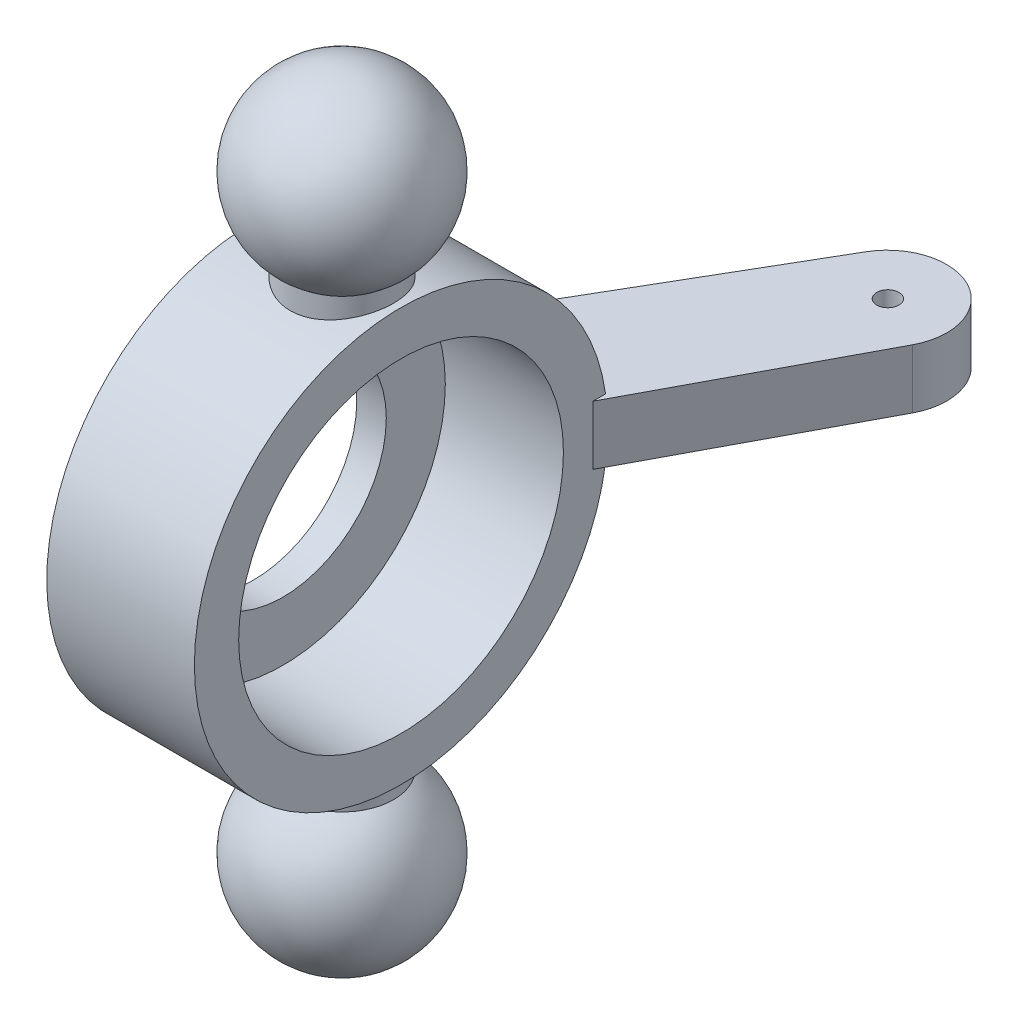
ISO-10303-21;
HEADER;
FILE_DESCRIPTION(('STEP AP214'),'2;1');
FILE_NAME('part.step','',(''),(''),'','','');
FILE_SCHEMA(('AUTOMOTIVE_DESIGN { 1 0 10303 214 1 1 1 1 }'));
ENDSEC;
DATA;
#1=APPLICATION_CONTEXT('core data for automotive mechanical design processes');
#2=APPLICATION_PROTOCOL_DEFINITION('international standard','automotive_design',2000,#1);
#3=PRODUCT_CONTEXT('',#1,'mechanical');
#4=PRODUCT('Part','Part','',(#3));
#5=PRODUCT_RELATED_PRODUCT_CATEGORY('part','',(#4));
#6=PRODUCT_DEFINITION_FORMATION('','',#4);
#7=PRODUCT_DEFINITION_CONTEXT('part definition',#1,'design');
#8=PRODUCT_DEFINITION('design','',#6,#7);
#9=PRODUCT_DEFINITION_SHAPE('','',#8);
#10=(LENGTH_UNIT() NAMED_UNIT(*) SI_UNIT(.MILLI.,.METRE.));
#11=(NAMED_UNIT(*) PLANE_ANGLE_UNIT() SI_UNIT($,.RADIAN.));
#12=(NAMED_UNIT(*) SI_UNIT($,.STERADIAN.) SOLID_ANGLE_UNIT());
#13=UNCERTAINTY_MEASURE_WITH_UNIT(LENGTH_MEASURE(1.E-05),#10,'distance_accuracy_value','');
#14=(GEOMETRIC_REPRESENTATION_CONTEXT(3) GLOBAL_UNCERTAINTY_ASSIGNED_CONTEXT((#13)) GLOBAL_UNIT_ASSIGNED_CONTEXT((#10,
#11,#12)) REPRESENTATION_CONTEXT('',''));
#15=CARTESIAN_POINT('',(0.,0.,0.));
#16=DIRECTION('',(0.,0.,1.));
#17=DIRECTION('',(1.,0.,0.));
#18=AXIS2_PLACEMENT_3D('',#15,#16,#17);
#19=CARTESIAN_POINT('',(20.,0.,0.));
#20=DIRECTION('',(-1.,0.,0.));
#21=DIRECTION('',(0.,0.,-1.));
#22=AXIS2_PLACEMENT_3D('',#19,#20,#21);
#23=PLANE('',#22);
#24=CARTESIAN_POINT('',(20.,0.,0.));
#25=DIRECTION('',(1.,0.,0.));
#26=DIRECTION('',(0.,0.,-1.));
#27=AXIS2_PLACEMENT_3D('',#24,#25,#26);
#28=CIRCLE('',#27,11.);
#29=CARTESIAN_POINT('',(20.,0.,-11.));
#30=VERTEX_POINT('',#29);
#31=EDGE_CURVE('E176',#30,#30,#28,.T.);
#32=ORIENTED_EDGE('',*,*,#31,.F.);
#33=EDGE_LOOP('',(#32));
#34=FACE_BOUND('',#33,.T.);
#35=DIRECTION('',(0.,0.,1.));
#36=VECTOR('',#35,1.);
#37=CARTESIAN_POINT('',(20.,-2.,0.));
#38=LINE('',#37,#36);
#39=CARTESIAN_POINT('',(20.,-2.,-13.856406460551));
#40=VERTEX_POINT('',#39);
#41=CARTESIAN_POINT('',(20.,-2.,-13.));
#42=VERTEX_POINT('',#41);
#43=EDGE_CURVE('E159',#40,#42,#38,.T.);
#44=ORIENTED_EDGE('',*,*,#43,.T.);
#45=DIRECTION('',(0.,1.,0.));
#46=VECTOR('',#45,1.);
#47=CARTESIAN_POINT('',(20.,-2.,-13.));
#48=LINE('',#47,#46);
#49=CARTESIAN_POINT('',(20.,2.,-13.));
#50=VERTEX_POINT('',#49);
#51=EDGE_CURVE('E147',#42,#50,#48,.T.);
#52=ORIENTED_EDGE('',*,*,#51,.T.);
#53=DIRECTION('',(0.,0.,1.));
#54=VECTOR('',#53,1.);
#55=CARTESIAN_POINT('',(20.,2.,0.));
#56=LINE('',#55,#54);
#57=CARTESIAN_POINT('',(20.,2.,-13.856406460551));
#58=VERTEX_POINT('',#57);
#59=EDGE_CURVE('E156',#58,#50,#56,.T.);
#60=ORIENTED_EDGE('',*,*,#59,.F.);
#61=CARTESIAN_POINT('',(20.,0.,0.));
#62=DIRECTION('',(1.,0.,0.));
#63=DIRECTION('',(0.,0.,-1.));
#64=AXIS2_PLACEMENT_3D('',#61,#62,#63);
#65=CIRCLE('',#64,14.);
#66=EDGE_CURVE('E179',#58,#40,#65,.T.);
#67=ORIENTED_EDGE('',*,*,#66,.T.);
#68=EDGE_LOOP('',(#44,#52,#60,#67));
#69=FACE_BOUND('',#68,.T.);
#70=ADVANCED_FACE('F39',(#34,#69),#23,.F.);
#71=CARTESIAN_POINT('',(12.,0.,0.));
#72=DIRECTION('',(1.,0.,0.));
#73=DIRECTION('',(0.,0.,1.));
#74=AXIS2_PLACEMENT_3D('',#71,#72,#73);
#75=CYLINDRICAL_SURFACE('',#74,14.);
#76=CARTESIAN_POINT('',(10.,0.,0.));
#77=DIRECTION('',(1.,0.,0.));
#78=DIRECTION('',(0.,0.,-1.));
#79=AXIS2_PLACEMENT_3D('',#76,#77,#78);
#80=CIRCLE('',#79,14.);
#81=CARTESIAN_POINT('',(10.,0.,-14.));
#82=VERTEX_POINT('',#81);
#83=EDGE_CURVE('E167',#82,#82,#80,.T.);
#84=ORIENTED_EDGE('',*,*,#83,.T.);
#85=EDGE_LOOP('',(#84));
#86=FACE_BOUND('',#85,.T.);
#87=CARTESIAN_POINT('',(16.,13.555441711726,-3.5));
#88=CARTESIAN_POINT('',(15.8067289487028,13.55544540123,-3.4999945100303));
#89=CARTESIAN_POINT('',(15.6133971418501,13.5596202842044,-3.48393674369671));
#90=CARTESIAN_POINT('',(15.2322853905571,13.5758260678959,-3.42023237564931));
#91=CARTESIAN_POINT('',(15.0445087437445,13.5878615407028,-3.37256738943895));
#92=CARTESIAN_POINT('',(14.6800750465379,13.6183421443461,-3.24728767948486));
#93=CARTESIAN_POINT('',(14.50340398246,13.6367789976664,-3.16971161899629));
#94=CARTESIAN_POINT('',(14.1655648064442,13.6779746884026,-2.98692959776594));
#95=CARTESIAN_POINT('',(14.0043973530877,13.7007337092988,-2.88172246398496));
#96=CARTESIAN_POINT('',(13.6985936966329,13.7485700289787,-2.64419179823663));
#97=CARTESIAN_POINT('',(13.5543489595099,13.7736843667225,-2.51137164278567));
#98=CARTESIAN_POINT('',(13.2899340478955,13.8230802572141,-2.22345488974093));
#99=CARTESIAN_POINT('',(13.1697661241296,13.8473617319294,-2.06835621185243));
#100=CARTESIAN_POINT('',(12.9553143453162,13.8927658172882,-1.73760328151054));
#101=CARTESIAN_POINT('',(12.861415056574,13.9138396236083,-1.56169240667317));
#102=CARTESIAN_POINT('',(12.7046664981857,13.9500313669638,-1.19596845800987));
#103=CARTESIAN_POINT('',(12.6418126473183,13.9651501826808,-1.00615744010872));
#104=CARTESIAN_POINT('',(12.55019303159,13.9874666238745,-0.622102262255826));
#105=CARTESIAN_POINT('',(12.5207624979428,13.9948185138204,-0.428025807368566));
#106=CARTESIAN_POINT('',(12.4947382690142,14.0013103175022,-0.0375603469678755));
#107=CARTESIAN_POINT('',(12.4981397189066,14.000451445354,0.1588283123533));
#108=CARTESIAN_POINT('',(12.5372047903502,13.9907333293494,0.543732865103353));
#109=CARTESIAN_POINT('',(12.5721508550754,13.9820520327718,0.732326754603722));
#110=CARTESIAN_POINT('',(12.6721597780679,13.9578717113484,1.10088386594792));
#111=CARTESIAN_POINT('',(12.7372242395285,13.9423723235797,1.28084662779658));
#112=CARTESIAN_POINT('',(12.8962035989618,13.906025135811,1.62892346225627));
#113=CARTESIAN_POINT('',(12.9903738625261,13.8851302757249,1.79691578418258));
#114=CARTESIAN_POINT('',(13.2046979507632,13.8402586533409,2.1149646781919));
#115=CARTESIAN_POINT('',(13.3248562959863,13.8162813551566,2.26501812279998));
#116=CARTESIAN_POINT('',(13.5915922387738,13.767091992751,2.54720912279662));
#117=CARTESIAN_POINT('',(13.7387968492812,13.7418640732785,2.67875187676046));
#118=CARTESIAN_POINT('',(14.0534399629621,13.6936106093183,2.91541731587331));
#119=CARTESIAN_POINT('',(14.2208794113088,13.6705851677987,3.0205387661713));
#120=CARTESIAN_POINT('',(14.572406047792,13.6292869553258,3.20175845157131));
#121=CARTESIAN_POINT('',(14.7565700223683,13.6110377709745,3.27771348436242));
#122=CARTESIAN_POINT('',(15.1356196552351,13.5816609610198,3.39739967219245));
#123=CARTESIAN_POINT('',(15.3305030095563,13.5705318115174,3.44113772292637));
#124=CARTESIAN_POINT('',(15.7199433021574,13.5569749843781,3.49416149414056));
#125=CARTESIAN_POINT('',(15.9143729106816,13.5543252457504,3.50432666348898));
#126=CARTESIAN_POINT('',(16.3021507112152,13.5574228070324,3.49232378671901));
#127=CARTESIAN_POINT('',(16.4954990011281,13.5631693339647,3.47015871698913));
#128=CARTESIAN_POINT('',(16.8723599709291,13.5821991478089,3.39489564951413));
#129=CARTESIAN_POINT('',(17.0559818171972,13.5953575834006,3.34230969559482));
#130=CARTESIAN_POINT('',(17.4118040409944,13.6276100556741,3.20826531433849));
#131=CARTESIAN_POINT('',(17.584003062678,13.6467047954483,3.12680346679746));
#132=CARTESIAN_POINT('',(17.9158177890137,13.6891459193386,2.93547893511129));
#133=CARTESIAN_POINT('',(18.0751203760602,13.7125683605018,2.82509045536991));
#134=CARTESIAN_POINT('',(18.373263707922,13.7608391629952,2.57971102527057));
#135=CARTESIAN_POINT('',(18.5121010833101,13.7856877581962,2.44471603181903));
#136=CARTESIAN_POINT('',(18.7689354595993,13.8347636424449,2.14991952344655));
#137=CARTESIAN_POINT('',(18.8863240875683,13.8589598288664,1.98958183386057));
#138=CARTESIAN_POINT('',(19.0925102137317,13.9033610325916,1.65095938943136));
#139=CARTESIAN_POINT('',(19.1813092032515,13.9235662580553,1.47267557135157));
#140=CARTESIAN_POINT('',(19.3270244483391,13.9575816203366,1.10445370605882));
#141=CARTESIAN_POINT('',(19.3841699981307,13.9714376203137,0.914610833597587));
#142=CARTESIAN_POINT('',(19.4656444684518,13.991394107541,0.527624161115824));
#143=CARTESIAN_POINT('',(19.4899797222347,13.9974960915079,0.330481777644342));
#144=CARTESIAN_POINT('',(19.5047865635144,14.0011959293082,-0.0597923425516314));
#145=CARTESIAN_POINT('',(19.4961559818339,13.9990192607996,-0.252888394381077));
#146=CARTESIAN_POINT('',(19.4473326044698,13.9869063760105,-0.634786237451629));
#147=CARTESIAN_POINT('',(19.4071407474539,13.9769703905009,-0.823588156233251));
#148=CARTESIAN_POINT('',(19.296817230802,13.9504901498861,-1.19059862475671));
#149=CARTESIAN_POINT('',(19.2268479133997,13.9339817575837,-1.36885873103302));
#150=CARTESIAN_POINT('',(19.0591029734315,13.896095111978,-1.71120968564569));
#151=CARTESIAN_POINT('',(18.9613238456533,13.8747162448565,-1.87529874442972));
#152=CARTESIAN_POINT('',(18.7379966810135,13.82875373881,-2.18890674948156));
#153=CARTESIAN_POINT('',(18.6118394998366,13.8041055929583,-2.33798245904418));
#154=CARTESIAN_POINT('',(18.3365200180793,13.7546727170016,-2.61315257095726));
#155=CARTESIAN_POINT('',(18.1873518936109,13.7298879538556,-2.73924113776807));
#156=CARTESIAN_POINT('',(17.8668950503369,13.6824616545926,-2.96716709265141));
#157=CARTESIAN_POINT('',(17.6952455682216,13.6598687285651,-3.06850816795732));
#158=CARTESIAN_POINT('',(17.3368057854381,13.620038442319,-3.24074413804914));
#159=CARTESIAN_POINT('',(17.1500266186715,13.6027971881625,-3.31166118413253));
#160=CARTESIAN_POINT('',(16.8029804585769,13.5783168062758,-3.41047884999851));
#161=CARTESIAN_POINT('',(16.6443739246485,13.5698032051225,-3.44397609708907));
#162=CARTESIAN_POINT('',(16.3238589585081,13.5583643503917,-3.48873802400119));
#163=CARTESIAN_POINT('',(16.1619508091446,13.5554386201188,-3.50000460030113));
#164=CARTESIAN_POINT('',(16.,13.555441711726,-3.5));
#165=B_SPLINE_CURVE_WITH_KNOTS('',3,(#87,#88,#89,#90,#91,#92,#93,#94,#95,#96,#97,#98,#99,#100,
#101,#102,#103,#104,#105,#106,#107,#108,#109,#110,#111,#112,#113,#114,#115,#116,#117,#118,#119,
#120,#121,#122,#123,#124,#125,#126,#127,#128,#129,#130,#131,#132,#133,#134,#135,#136,#137,#138,
#139,#140,#141,#142,#143,#144,#145,#146,#147,#148,#149,#150,#151,#152,#153,#154,#155,#156,#157,
#158,#159,#160,#161,#162,#163,#164),.UNSPECIFIED.,.T.,.F.,(4,2,2,2,2,2,2,2,2,2,2,2,2,2,2,2,2,2,
2,2,2,2,2,2,2,2,2,2,2,2,2,2,2,2,2,2,2,2,4),(0.,0.57921841843059,1.15877403800013,
1.73758301803243,2.3164165745767,2.90673535870167,3.49710930071813,4.09572094957088,
4.69424423785929,5.28064251393485,5.86695408132429,6.44025567764526,7.01358779414701,
7.59210023956223,8.17071339656479,8.76498653200676,9.35928743679723,9.95647004813416,
10.5535248018492,11.1348100467344,11.716041780678,12.2877636702336,12.8595533000046,
13.4425598421329,14.0256622644954,14.6233546336192,15.2210158201785,15.8142890194017,
16.4074476848313,16.9845682458891,17.5616716433825,18.1356682719407,18.7097372804377,
19.2975593522537,19.8855304420219,20.4844706821114,21.0829740992857,21.5683695806357,
22.0537236515463),.UNSPECIFIED.);
#166=CARTESIAN_POINT('',(16.,13.555441711726,-3.5));
#167=VERTEX_POINT('',#166);
#168=EDGE_CURVE('E180',#167,#167,#165,.T.);
#169=ORIENTED_EDGE('',*,*,#168,.F.);
#170=EDGE_LOOP('',(#169));
#171=FACE_BOUND('',#170,.T.);
#172=CARTESIAN_POINT('',(16.,-13.555441711726,-3.5));
#173=CARTESIAN_POINT('',(16.1932710512972,-13.55544540123,-3.4999945100303));
#174=CARTESIAN_POINT('',(16.3866028581499,-13.5596202842044,-3.48393674369671));
#175=CARTESIAN_POINT('',(16.7677146094429,-13.5758260678959,-3.42023237564931));
#176=CARTESIAN_POINT('',(16.9554912562555,-13.5878615407028,-3.37256738943895));
#177=CARTESIAN_POINT('',(17.3199249534621,-13.6183421443461,-3.24728767948486));
#178=CARTESIAN_POINT('',(17.49659601754,-13.6367789976664,-3.16971161899629));
#179=CARTESIAN_POINT('',(17.8344351935558,-13.6779746884026,-2.98692959776594));
#180=CARTESIAN_POINT('',(17.9956026469123,-13.7007337092988,-2.88172246398496));
#181=CARTESIAN_POINT('',(18.3014063033671,-13.7485700289787,-2.64419179823663));
#182=CARTESIAN_POINT('',(18.4456510404901,-13.7736843667225,-2.51137164278567));
#183=CARTESIAN_POINT('',(18.7100659521045,-13.8230802572141,-2.22345488974093));
#184=CARTESIAN_POINT('',(18.8302338758704,-13.8473617319294,-2.06835621185243));
#185=CARTESIAN_POINT('',(19.0446856546838,-13.8927658172882,-1.73760328151054));
#186=CARTESIAN_POINT('',(19.1385849434261,-13.9138396236083,-1.56169240667317));
#187=CARTESIAN_POINT('',(19.2953335018143,-13.9500313669638,-1.19596845800987));
#188=CARTESIAN_POINT('',(19.3581873526817,-13.9651501826808,-1.00615744010872));
#189=CARTESIAN_POINT('',(19.44980696841,-13.9874666238745,-0.622102262255827));
#190=CARTESIAN_POINT('',(19.4792375020572,-13.9948185138204,-0.428025807368567));
#191=CARTESIAN_POINT('',(19.5052617309858,-14.0013103175022,-0.0375603469678765));
#192=CARTESIAN_POINT('',(19.5018602810934,-14.000451445354,0.158828312353299));
#193=CARTESIAN_POINT('',(19.4627952096498,-13.9907333293494,0.543732865103351));
#194=CARTESIAN_POINT('',(19.4278491449246,-13.9820520327718,0.73232675460372));
#195=CARTESIAN_POINT('',(19.3278402219321,-13.9578717113484,1.10088386594791));
#196=CARTESIAN_POINT('',(19.2627757604715,-13.9423723235797,1.28084662779658));
#197=CARTESIAN_POINT('',(19.1037964010382,-13.906025135811,1.62892346225627));
#198=CARTESIAN_POINT('',(19.0096261374739,-13.8851302757249,1.79691578418258));
#199=CARTESIAN_POINT('',(18.7953020492368,-13.8402586533409,2.1149646781919));
#200=CARTESIAN_POINT('',(18.6751437040137,-13.8162813551566,2.26501812279998));
#201=CARTESIAN_POINT('',(18.4084077612262,-13.767091992751,2.54720912279662));
#202=CARTESIAN_POINT('',(18.2612031507188,-13.7418640732785,2.67875187676045));
#203=CARTESIAN_POINT('',(17.9465600370379,-13.6936106093183,2.91541731587331));
#204=CARTESIAN_POINT('',(17.7791205886912,-13.6705851677987,3.0205387661713));
#205=CARTESIAN_POINT('',(17.427593952208,-13.6292869553258,3.20175845157131));
#206=CARTESIAN_POINT('',(17.2434299776317,-13.6110377709745,3.27771348436242));
#207=CARTESIAN_POINT('',(16.8643803447649,-13.5816609610198,3.39739967219245));
#208=CARTESIAN_POINT('',(16.6694969904437,-13.5705318115174,3.44113772292637));
#209=CARTESIAN_POINT('',(16.2800566978426,-13.5569749843781,3.49416149414056));
#210=CARTESIAN_POINT('',(16.0856270893184,-13.5543252457504,3.50432666348898));
#211=CARTESIAN_POINT('',(15.6978492887848,-13.5574228070324,3.49232378671901));
#212=CARTESIAN_POINT('',(15.5045009988719,-13.5631693339647,3.47015871698913));
#213=CARTESIAN_POINT('',(15.1276400290709,-13.5821991478089,3.39489564951413));
#214=CARTESIAN_POINT('',(14.9440181828028,-13.5953575834006,3.34230969559482));
#215=CARTESIAN_POINT('',(14.5881959590056,-13.6276100556741,3.20826531433849));
#216=CARTESIAN_POINT('',(14.415996937322,-13.6467047954483,3.12680346679746));
#217=CARTESIAN_POINT('',(14.0841822109863,-13.6891459193386,2.93547893511128));
#218=CARTESIAN_POINT('',(13.9248796239398,-13.7125683605018,2.82509045536991));
#219=CARTESIAN_POINT('',(13.626736292078,-13.7608391629952,2.57971102527057));
#220=CARTESIAN_POINT('',(13.4878989166899,-13.7856877581962,2.44471603181903));
#221=CARTESIAN_POINT('',(13.2310645404007,-13.8347636424449,2.14991952344655));
#222=CARTESIAN_POINT('',(13.1136759124317,-13.8589598288664,1.98958183386058));
#223=CARTESIAN_POINT('',(12.9074897862682,-13.9033610325916,1.65095938943136));
#224=CARTESIAN_POINT('',(12.8186907967485,-13.9235662580553,1.47267557135157));
#225=CARTESIAN_POINT('',(12.6729755516609,-13.9575816203366,1.10445370605882));
#226=CARTESIAN_POINT('',(12.6158300018693,-13.9714376203137,0.914610833597587));
#227=CARTESIAN_POINT('',(12.5343555315482,-13.991394107541,0.527624161115824));
#228=CARTESIAN_POINT('',(12.5100202777653,-13.9974960915079,0.330481777644341));
#229=CARTESIAN_POINT('',(12.4952134364856,-14.0011959293082,-0.0597923425516321));
#230=CARTESIAN_POINT('',(12.5038440181661,-13.9990192607996,-0.252888394381078));
#231=CARTESIAN_POINT('',(12.5526673955302,-13.9869063760105,-0.63478623745163));
#232=CARTESIAN_POINT('',(12.5928592525461,-13.9769703905009,-0.823588156233251));
#233=CARTESIAN_POINT('',(12.703182769198,-13.9504901498861,-1.19059862475671));
#234=CARTESIAN_POINT('',(12.7731520866003,-13.9339817575837,-1.36885873103302));
#235=CARTESIAN_POINT('',(12.9408970265685,-13.896095111978,-1.71120968564569));
#236=CARTESIAN_POINT('',(13.0386761543467,-13.8747162448565,-1.87529874442972));
#237=CARTESIAN_POINT('',(13.2620033189865,-13.82875373881,-2.18890674948156));
#238=CARTESIAN_POINT('',(13.3881605001634,-13.8041055929583,-2.33798245904418));
#239=CARTESIAN_POINT('',(13.6634799819207,-13.7546727170016,-2.61315257095726));
#240=CARTESIAN_POINT('',(13.8126481063891,-13.7298879538556,-2.73924113776807));
#241=CARTESIAN_POINT('',(14.1331049496631,-13.6824616545926,-2.96716709265141));
#242=CARTESIAN_POINT('',(14.3047544317784,-13.6598687285651,-3.06850816795733));
#243=CARTESIAN_POINT('',(14.6631942145619,-13.620038442319,-3.24074413804914));
#244=CARTESIAN_POINT('',(14.8499733813285,-13.6027971881625,-3.31166118413253));
#245=CARTESIAN_POINT('',(15.1970195414231,-13.5783168062758,-3.41047884999851));
#246=CARTESIAN_POINT('',(15.3556260753515,-13.5698032051225,-3.44397609708907));
#247=CARTESIAN_POINT('',(15.6761410414919,-13.5583643503917,-3.48873802400119));
#248=CARTESIAN_POINT('',(15.8380491908554,-13.5554386201188,-3.50000460030113));
#249=CARTESIAN_POINT('',(16.,-13.555441711726,-3.5));
#250=B_SPLINE_CURVE_WITH_KNOTS('',3,(#172,#173,#174,#175,#176,#177,#178,#179,#180,#181,#182,
#183,#184,#185,#186,#187,#188,#189,#190,#191,#192,#193,#194,#195,#196,#197,#198,#199,#200,#201,
#202,#203,#204,#205,#206,#207,#208,#209,#210,#211,#212,#213,#214,#215,#216,#217,#218,#219,#220,
#221,#222,#223,#224,#225,#226,#227,#228,#229,#230,#231,#232,#233,#234,#235,#236,#237,#238,#239,
#240,#241,#242,#243,#244,#245,#246,#247,#248,#249),.UNSPECIFIED.,.T.,.F.,(4,2,2,2,2,2,2,2,2,2,2,
2,2,2,2,2,2,2,2,2,2,2,2,2,2,2,2,2,2,2,2,2,2,2,2,2,2,2,4),(0.,0.57921841843059,1.15877403800013,
1.73758301803243,2.3164165745767,2.90673535870167,3.49710930071813,4.09572094957088,
4.69424423785929,5.28064251393485,5.86695408132429,6.44025567764526,7.013587794147,
7.59210023956223,8.17071339656479,8.76498653200676,9.35928743679723,9.95647004813415,
10.5535248018492,11.1348100467344,11.716041780678,12.2877636702336,12.8595533000046,
13.4425598421329,14.0256622644954,14.6233546336192,15.2210158201785,15.8142890194018,
16.4074476848313,16.9845682458891,17.5616716433825,18.1356682719407,18.7097372804378,
19.2975593522537,19.8855304420219,20.4844706821114,21.0829740992857,21.5683695806357,
22.0537236515463),.UNSPECIFIED.);
#251=CARTESIAN_POINT('',(16.,-13.555441711726,-3.5));
#252=VERTEX_POINT('',#251);
#253=EDGE_CURVE('E175',#252,#252,#250,.T.);
#254=ORIENTED_EDGE('',*,*,#253,.F.);
#255=EDGE_LOOP('',(#254));
#256=FACE_BOUND('',#255,.T.);
#257=DIRECTION('',(1.,0.,0.));
#258=VECTOR('',#257,1.);
#259=CARTESIAN_POINT('',(12.,-2.,-13.856406460551));
#260=LINE('',#259,#258);
#261=CARTESIAN_POINT('',(10.4981797154384,-2.,-13.856406460551));
#262=VERTEX_POINT('',#261);
#263=EDGE_CURVE('E62',#262,#40,#260,.T.);
#264=ORIENTED_EDGE('',*,*,#263,.T.);
#265=ORIENTED_EDGE('',*,*,#66,.F.);
#266=DIRECTION('',(1.,0.,0.));
#267=VECTOR('',#266,1.);
#268=CARTESIAN_POINT('',(12.,2.,-13.856406460551));
#269=LINE('',#268,#267);
#270=CARTESIAN_POINT('',(10.4981797154384,2.,-13.856406460551));
#271=VERTEX_POINT('',#270);
#272=EDGE_CURVE('E55',#271,#58,#269,.T.);
#273=ORIENTED_EDGE('',*,*,#272,.F.);
#274=CARTESIAN_POINT('',(2.43777738840073,0.,0.));
#275=DIRECTION('',(0.864389195397262,0.,0.502823347588867));
#276=DIRECTION('',(0.502823347588867,0.,-0.864389195397262));
#277=AXIS2_PLACEMENT_3D('',#274,#275,#276);
#278=ELLIPSE('',#277,16.1964079080903,14.);
#279=EDGE_CURVE('E122',#262,#271,#278,.T.);
#280=ORIENTED_EDGE('',*,*,#279,.F.);
#281=EDGE_LOOP('',(#264,#265,#273,#280));
#282=FACE_BOUND('',#281,.T.);
#283=ADVANCED_FACE('F41',(#86,#171,#256,#282),#75,.T.);
#284=CARTESIAN_POINT('',(12.,0.,0.));
#285=DIRECTION('',(1.,0.,0.));
#286=DIRECTION('',(0.,0.,1.));
#287=AXIS2_PLACEMENT_3D('',#284,#285,#286);
#288=CYLINDRICAL_SURFACE('',#287,11.);
#289=CARTESIAN_POINT('',(12.,0.,0.));
#290=DIRECTION('',(1.,0.,0.));
#291=DIRECTION('',(0.,0.,-1.));
#292=AXIS2_PLACEMENT_3D('',#289,#290,#291);
#293=CIRCLE('',#292,11.);
#294=CARTESIAN_POINT('',(12.,0.,-11.));
#295=VERTEX_POINT('',#294);
#296=EDGE_CURVE('E172',#295,#295,#293,.T.);
#297=ORIENTED_EDGE('',*,*,#296,.F.);
#298=EDGE_LOOP('',(#297));
#299=FACE_BOUND('',#298,.T.);
#300=ORIENTED_EDGE('',*,*,#31,.T.);
#301=EDGE_LOOP('',(#300));
#302=FACE_BOUND('',#301,.T.);
#303=ADVANCED_FACE('F194',(#299,#302),#288,.F.);
#304=CARTESIAN_POINT('',(16.,12.,0.));
#305=DIRECTION('',(0.,-1.,0.));
#306=DIRECTION('',(0.,0.,-1.));
#307=AXIS2_PLACEMENT_3D('',#304,#305,#306);
#308=CYLINDRICAL_SURFACE('',#307,3.5);
#309=CARTESIAN_POINT('',(16.,15.1266028275955,0.));
#310=DIRECTION('',(0.,-1.,0.));
#311=DIRECTION('',(0.,0.,1.));
#312=AXIS2_PLACEMENT_3D('',#309,#310,#311);
#313=CIRCLE('',#312,3.5);
#314=CARTESIAN_POINT('',(16.,15.1266028275955,3.5));
#315=VERTEX_POINT('',#314);
#316=EDGE_CURVE('E48',#315,#315,#313,.T.);
#317=ORIENTED_EDGE('',*,*,#316,.T.);
#318=EDGE_LOOP('',(#317));
#319=FACE_BOUND('',#318,.T.);
#320=ORIENTED_EDGE('',*,*,#168,.T.);
#321=EDGE_LOOP('',(#320));
#322=FACE_BOUND('',#321,.T.);
#323=ADVANCED_FACE('F188',(#319,#322),#308,.T.);
#324=CARTESIAN_POINT('',(16.,20.,0.));
#325=DIRECTION('',(0.,-1.,0.));
#326=DIRECTION('',(0.,0.,1.));
#327=AXIS2_PLACEMENT_3D('',#324,#325,#326);
#328=SPHERICAL_SURFACE('',#327,6.);
#329=ORIENTED_EDGE('',*,*,#316,.F.);
#330=EDGE_LOOP('',(#329));
#331=FACE_BOUND('',#330,.T.);
#332=ADVANCED_FACE('F193',(#331),#328,.T.);
#333=CARTESIAN_POINT('',(16.,-12.,0.));
#334=DIRECTION('',(0.,1.,0.));
#335=DIRECTION('',(0.,0.,-1.));
#336=AXIS2_PLACEMENT_3D('',#333,#334,#335);
#337=CYLINDRICAL_SURFACE('',#336,3.5);
#338=CARTESIAN_POINT('',(16.,-15.1266028275955,0.));
#339=DIRECTION('',(0.,1.,0.));
#340=DIRECTION('',(0.,0.,-1.));
#341=AXIS2_PLACEMENT_3D('',#338,#339,#340);
#342=CIRCLE('',#341,3.5);
#343=CARTESIAN_POINT('',(16.,-15.1266028275955,-3.5));
#344=VERTEX_POINT('',#343);
#345=EDGE_CURVE('E11',#344,#344,#342,.T.);
#346=ORIENTED_EDGE('',*,*,#345,.T.);
#347=EDGE_LOOP('',(#346));
#348=FACE_BOUND('',#347,.T.);
#349=ORIENTED_EDGE('',*,*,#253,.T.);
#350=EDGE_LOOP('',(#349));
#351=FACE_BOUND('',#350,.T.);
#352=ADVANCED_FACE('F249',(#348,#351),#337,.T.);
#353=CARTESIAN_POINT('',(16.,-20.,0.));
#354=DIRECTION('',(0.,1.,0.));
#355=DIRECTION('',(0.,0.,1.));
#356=AXIS2_PLACEMENT_3D('',#353,#354,#355);
#357=SPHERICAL_SURFACE('',#356,6.);
#358=ORIENTED_EDGE('',*,*,#345,.F.);
#359=EDGE_LOOP('',(#358));
#360=FACE_BOUND('',#359,.T.);
#361=ADVANCED_FACE('F246',(#360),#357,.T.);
#362=CARTESIAN_POINT('',(12.,0.,0.));
#363=DIRECTION('',(-1.,0.,0.));
#364=DIRECTION('',(0.,0.,-1.));
#365=AXIS2_PLACEMENT_3D('',#362,#363,#364);
#366=PLANE('',#365);
#367=CARTESIAN_POINT('',(12.,0.,0.));
#368=DIRECTION('',(1.,0.,0.));
#369=DIRECTION('',(0.,0.,-1.));
#370=AXIS2_PLACEMENT_3D('',#367,#368,#369);
#371=CIRCLE('',#370,7.);
#372=CARTESIAN_POINT('',(12.,0.,-7.));
#373=VERTEX_POINT('',#372);
#374=EDGE_CURVE('E163',#373,#373,#371,.T.);
#375=ORIENTED_EDGE('',*,*,#374,.F.);
#376=EDGE_LOOP('',(#375));
#377=FACE_BOUND('',#376,.T.);
#378=ORIENTED_EDGE('',*,*,#296,.T.);
#379=EDGE_LOOP('',(#378));
#380=FACE_BOUND('',#379,.T.);
#381=ADVANCED_FACE('F242',(#377,#380),#366,.F.);
#382=CARTESIAN_POINT('',(10.,0.,0.));
#383=DIRECTION('',(-1.,0.,0.));
#384=DIRECTION('',(0.,0.,-1.));
#385=AXIS2_PLACEMENT_3D('',#382,#383,#384);
#386=PLANE('',#385);
#387=ORIENTED_EDGE('',*,*,#83,.F.);
#388=EDGE_LOOP('',(#387));
#389=FACE_BOUND('',#388,.T.);
#390=CARTESIAN_POINT('',(10.,0.,0.));
#391=DIRECTION('',(1.,0.,0.));
#392=DIRECTION('',(0.,0.,-1.));
#393=AXIS2_PLACEMENT_3D('',#390,#391,#392);
#394=CIRCLE('',#393,7.);
#395=CARTESIAN_POINT('',(10.,0.,-7.));
#396=VERTEX_POINT('',#395);
#397=EDGE_CURVE('E164',#396,#396,#394,.T.);
#398=ORIENTED_EDGE('',*,*,#397,.T.);
#399=EDGE_LOOP('',(#398));
#400=FACE_BOUND('',#399,.T.);
#401=ADVANCED_FACE('F238',(#389,#400),#386,.T.);
#402=CARTESIAN_POINT('',(10.,0.,0.));
#403=DIRECTION('',(1.,0.,0.));
#404=DIRECTION('',(0.,0.,1.));
#405=AXIS2_PLACEMENT_3D('',#402,#403,#404);
#406=CYLINDRICAL_SURFACE('',#405,7.);
#407=ORIENTED_EDGE('',*,*,#397,.F.);
#408=EDGE_LOOP('',(#407));
#409=FACE_BOUND('',#408,.T.);
#410=ORIENTED_EDGE('',*,*,#374,.T.);
#411=EDGE_LOOP('',(#410));
#412=FACE_BOUND('',#411,.T.);
#413=ADVANCED_FACE('F235',(#409,#412),#406,.F.);
#414=CARTESIAN_POINT('',(10.,-2.,-13.));
#415=DIRECTION('',(-0.864389195397262,0.,-0.502823347588867));
#416=DIRECTION('',(0.502823347588867,0.,-0.864389195397262));
#417=AXIS2_PLACEMENT_3D('',#414,#415,#416);
#418=PLANE('',#417);
#419=ORIENTED_EDGE('',*,*,#279,.T.);
#420=DIRECTION('',(0.502823347588867,0.,-0.864389195397262));
#421=VECTOR('',#420,1.);
#422=CARTESIAN_POINT('',(10.,2.,-13.));
#423=LINE('',#422,#421);
#424=CARTESIAN_POINT('',(20.4773392415919,2.,-31.0112933903555));
#425=VERTEX_POINT('',#424);
#426=EDGE_CURVE('E104',#271,#425,#423,.T.);
#427=ORIENTED_EDGE('',*,*,#426,.T.);
#428=DIRECTION('',(0.,1.,0.));
#429=VECTOR('',#428,1.);
#430=CARTESIAN_POINT('',(20.4773392415919,-2.,-31.0112933903555));
#431=LINE('',#430,#429);
#432=CARTESIAN_POINT('',(20.4773392415919,-2.,-31.0112933903555));
#433=VERTEX_POINT('',#432);
#434=EDGE_CURVE('E112',#433,#425,#431,.T.);
#435=ORIENTED_EDGE('',*,*,#434,.F.);
#436=DIRECTION('',(0.502823347588867,0.,-0.864389195397262));
#437=VECTOR('',#436,1.);
#438=CARTESIAN_POINT('',(10.,-2.,-13.));
#439=LINE('',#438,#437);
#440=EDGE_CURVE('E137',#262,#433,#439,.T.);
#441=ORIENTED_EDGE('',*,*,#440,.F.);
#442=EDGE_LOOP('',(#419,#427,#435,#441));
#443=FACE_BOUND('',#442,.T.);
#444=ADVANCED_FACE('F121',(#443),#418,.T.);
#445=CARTESIAN_POINT('',(23.9348960231809,-2.,-29.));
#446=DIRECTION('',(0.,1.,0.));
#447=DIRECTION('',(0.,0.,1.));
#448=AXIS2_PLACEMENT_3D('',#445,#446,#447);
#449=PLANE('',#448);
#450=CARTESIAN_POINT('',(23.9770707038275,-2.,-29.));
#451=DIRECTION('',(0.,-1.,0.));
#452=DIRECTION('',(0.,0.,1.));
#453=AXIS2_PLACEMENT_3D('',#450,#451,#452);
#454=CIRCLE('',#453,0.75);
#455=CARTESIAN_POINT('',(23.9770707038275,-2.,-28.25));
#456=VERTEX_POINT('',#455);
#457=EDGE_CURVE('E134',#456,#456,#454,.T.);
#458=ORIENTED_EDGE('',*,*,#457,.F.);
#459=EDGE_LOOP('',(#458));
#460=FACE_BOUND('',#459,.T.);
#461=ORIENTED_EDGE('',*,*,#263,.F.);
#462=ORIENTED_EDGE('',*,*,#440,.T.);
#463=CARTESIAN_POINT('',(23.9348960231809,-2.,-29.));
#464=DIRECTION('',(0.,-1.,0.));
#465=DIRECTION('',(0.,0.,1.));
#466=AXIS2_PLACEMENT_3D('',#463,#464,#465);
#467=CIRCLE('',#466,4.);
#468=CARTESIAN_POINT('',(23.9348960231809,-2.,-33.));
#469=VERTEX_POINT('',#468);
#470=EDGE_CURVE('E115',#433,#469,#467,.T.);
#471=ORIENTED_EDGE('',*,*,#470,.T.);
#472=DIRECTION('',(1.,0.,-1.64527479462118E-13));
#473=VECTOR('',#472,1.);
#474=CARTESIAN_POINT('',(23.9348960231809,-2.,-33.));
#475=LINE('',#474,#473);
#476=CARTESIAN_POINT('',(23.9770707038275,-2.,-33.));
#477=VERTEX_POINT('',#476);
#478=EDGE_CURVE('E140',#469,#477,#475,.T.);
#479=ORIENTED_EDGE('',*,*,#478,.T.);
#480=CARTESIAN_POINT('',(23.9770707038275,-2.,-29.));
#481=DIRECTION('',(0.,-1.,0.));
#482=DIRECTION('',(0.,0.,1.));
#483=AXIS2_PLACEMENT_3D('',#480,#481,#482);
#484=CIRCLE('',#483,4.);
#485=CARTESIAN_POINT('',(27.5088610752632,-2.,-27.1221137488564));
#486=VERTEX_POINT('',#485);
#487=EDGE_CURVE('E143',#477,#486,#484,.T.);
#488=ORIENTED_EDGE('',*,*,#487,.T.);
#489=DIRECTION('',(-0.469471562785893,0.,0.882947592858926));
#490=VECTOR('',#489,1.);
#491=CARTESIAN_POINT('',(27.5088610752632,-2.,-27.1221137488564));
#492=LINE('',#491,#490);
#493=EDGE_CURVE('E119',#486,#42,#492,.T.);
#494=ORIENTED_EDGE('',*,*,#493,.T.);
#495=ORIENTED_EDGE('',*,*,#43,.F.);
#496=EDGE_LOOP('',(#461,#462,#471,#479,#488,#494,#495));
#497=FACE_BOUND('',#496,.T.);
#498=ADVANCED_FACE('F211',(#460,#497),#449,.F.);
#499=CARTESIAN_POINT('',(23.9348960231809,2.,-29.));
#500=DIRECTION('',(0.,1.,0.));
#501=DIRECTION('',(0.,0.,1.));
#502=AXIS2_PLACEMENT_3D('',#499,#500,#501);
#503=PLANE('',#502);
#504=CARTESIAN_POINT('',(23.9770707038275,2.,-29.));
#505=DIRECTION('',(0.,-1.,0.));
#506=DIRECTION('',(0.,0.,1.));
#507=AXIS2_PLACEMENT_3D('',#504,#505,#506);
#508=CIRCLE('',#507,0.75);
#509=CARTESIAN_POINT('',(23.9770707038275,2.,-28.25));
#510=VERTEX_POINT('',#509);
#511=EDGE_CURVE('E123',#510,#510,#508,.T.);
#512=ORIENTED_EDGE('',*,*,#511,.T.);
#513=EDGE_LOOP('',(#512));
#514=FACE_BOUND('',#513,.T.);
#515=ORIENTED_EDGE('',*,*,#59,.T.);
#516=DIRECTION('',(-0.469471562785893,0.,0.882947592858926));
#517=VECTOR('',#516,1.);
#518=CARTESIAN_POINT('',(27.5088610752632,2.,-27.1221137488564));
#519=LINE('',#518,#517);
#520=CARTESIAN_POINT('',(27.5088610752632,2.,-27.1221137488564));
#521=VERTEX_POINT('',#520);
#522=EDGE_CURVE('E132',#521,#50,#519,.T.);
#523=ORIENTED_EDGE('',*,*,#522,.F.);
#524=CARTESIAN_POINT('',(23.9770707038275,2.,-29.));
#525=DIRECTION('',(0.,-1.,0.));
#526=DIRECTION('',(0.,0.,1.));
#527=AXIS2_PLACEMENT_3D('',#524,#525,#526);
#528=CIRCLE('',#527,4.);
#529=CARTESIAN_POINT('',(23.9770707038275,2.,-33.));
#530=VERTEX_POINT('',#529);
#531=EDGE_CURVE('E129',#530,#521,#528,.T.);
#532=ORIENTED_EDGE('',*,*,#531,.F.);
#533=DIRECTION('',(1.,0.,-1.64527479462118E-13));
#534=VECTOR('',#533,1.);
#535=CARTESIAN_POINT('',(23.9348960231809,2.,-33.));
#536=LINE('',#535,#534);
#537=CARTESIAN_POINT('',(23.9348960231809,2.,-33.));
#538=VERTEX_POINT('',#537);
#539=EDGE_CURVE('E108',#538,#530,#536,.T.);
#540=ORIENTED_EDGE('',*,*,#539,.F.);
#541=CARTESIAN_POINT('',(23.9348960231809,2.,-29.));
#542=DIRECTION('',(0.,-1.,0.));
#543=DIRECTION('',(0.,0.,1.));
#544=AXIS2_PLACEMENT_3D('',#541,#542,#543);
#545=CIRCLE('',#544,4.);
#546=EDGE_CURVE('E100',#425,#538,#545,.T.);
#547=ORIENTED_EDGE('',*,*,#546,.F.);
#548=ORIENTED_EDGE('',*,*,#426,.F.);
#549=ORIENTED_EDGE('',*,*,#272,.T.);
#550=EDGE_LOOP('',(#515,#523,#532,#540,#547,#548,#549));
#551=FACE_BOUND('',#550,.T.);
#552=ADVANCED_FACE('F102',(#514,#551),#503,.T.);
#553=CARTESIAN_POINT('',(27.5088610752632,-2.,-27.1221137488564));
#554=DIRECTION('',(0.882947592858926,0.,0.469471562785893));
#555=DIRECTION('',(-0.469471562785893,0.,0.882947592858926));
#556=AXIS2_PLACEMENT_3D('',#553,#554,#555);
#557=PLANE('',#556);
#558=ORIENTED_EDGE('',*,*,#51,.F.);
#559=ORIENTED_EDGE('',*,*,#493,.F.);
#560=DIRECTION('',(0.,1.,0.));
#561=VECTOR('',#560,1.);
#562=CARTESIAN_POINT('',(27.5088610752632,-2.,-27.1221137488564));
#563=LINE('',#562,#561);
#564=EDGE_CURVE('E150',#486,#521,#563,.T.);
#565=ORIENTED_EDGE('',*,*,#564,.T.);
#566=ORIENTED_EDGE('',*,*,#522,.T.);
#567=EDGE_LOOP('',(#558,#559,#565,#566));
#568=FACE_BOUND('',#567,.T.);
#569=ADVANCED_FACE('F215',(#568),#557,.T.);
#570=CARTESIAN_POINT('',(23.9770707038275,-2.,-29.));
#571=DIRECTION('',(0.,1.,0.));
#572=DIRECTION('',(0.,0.,1.));
#573=AXIS2_PLACEMENT_3D('',#570,#571,#572);
#574=CYLINDRICAL_SURFACE('',#573,4.);
#575=ORIENTED_EDGE('',*,*,#564,.F.);
#576=ORIENTED_EDGE('',*,*,#487,.F.);
#577=DIRECTION('',(0.,1.,0.));
#578=VECTOR('',#577,1.);
#579=CARTESIAN_POINT('',(23.9770707038275,-2.,-33.));
#580=LINE('',#579,#578);
#581=EDGE_CURVE('E152',#477,#530,#580,.T.);
#582=ORIENTED_EDGE('',*,*,#581,.T.);
#583=ORIENTED_EDGE('',*,*,#531,.T.);
#584=EDGE_LOOP('',(#575,#576,#582,#583));
#585=FACE_BOUND('',#584,.T.);
#586=ADVANCED_FACE('F218',(#585),#574,.T.);
#587=CARTESIAN_POINT('',(23.9348960231809,-2.,-33.));
#588=DIRECTION('',(-1.64527479462118E-13,0.,-1.));
#589=DIRECTION('',(1.,0.,-1.64527479462118E-13));
#590=AXIS2_PLACEMENT_3D('',#587,#588,#589);
#591=PLANE('',#590);
#592=ORIENTED_EDGE('',*,*,#581,.F.);
#593=ORIENTED_EDGE('',*,*,#478,.F.);
#594=DIRECTION('',(0.,1.,0.));
#595=VECTOR('',#594,1.);
#596=CARTESIAN_POINT('',(23.9348960231809,-2.,-33.));
#597=LINE('',#596,#595);
#598=EDGE_CURVE('E118',#469,#538,#597,.T.);
#599=ORIENTED_EDGE('',*,*,#598,.T.);
#600=ORIENTED_EDGE('',*,*,#539,.T.);
#601=EDGE_LOOP('',(#592,#593,#599,#600));
#602=FACE_BOUND('',#601,.T.);
#603=ADVANCED_FACE('F221',(#602),#591,.T.);
#604=CARTESIAN_POINT('',(23.9348960231809,-2.,-29.));
#605=DIRECTION('',(0.,1.,0.));
#606=DIRECTION('',(0.,0.,1.));
#607=AXIS2_PLACEMENT_3D('',#604,#605,#606);
#608=CYLINDRICAL_SURFACE('',#607,4.);
#609=ORIENTED_EDGE('',*,*,#598,.F.);
#610=ORIENTED_EDGE('',*,*,#470,.F.);
#611=ORIENTED_EDGE('',*,*,#434,.T.);
#612=ORIENTED_EDGE('',*,*,#546,.T.);
#613=EDGE_LOOP('',(#609,#610,#611,#612));
#614=FACE_BOUND('',#613,.T.);
#615=ADVANCED_FACE('F113',(#614),#608,.T.);
#616=CARTESIAN_POINT('',(23.9770707038275,-2.,-29.));
#617=DIRECTION('',(0.,1.,0.));
#618=DIRECTION('',(0.,0.,1.));
#619=AXIS2_PLACEMENT_3D('',#616,#617,#618);
#620=CYLINDRICAL_SURFACE('',#619,0.75);
#621=ORIENTED_EDGE('',*,*,#457,.T.);
#622=EDGE_LOOP('',(#621));
#623=FACE_BOUND('',#622,.T.);
#624=ORIENTED_EDGE('',*,*,#511,.F.);
#625=EDGE_LOOP('',(#624));
#626=FACE_BOUND('',#625,.T.);
#627=ADVANCED_FACE('F228',(#623,#626),#620,.F.);
#628=CLOSED_SHELL('',(#70,#283,#303,#323,#332,#352,#361,#381,#401,#413,#444,#498,#552,#569,#586,
#603,#615,#627));
#629=MANIFOLD_SOLID_BREP('B2',#628);
#630=ADVANCED_BREP_SHAPE_REPRESENTATION('',(#18,#629),#14);
#631=SHAPE_DEFINITION_REPRESENTATION(#9,#630);
ENDSEC;
END-ISO-10303-21;
